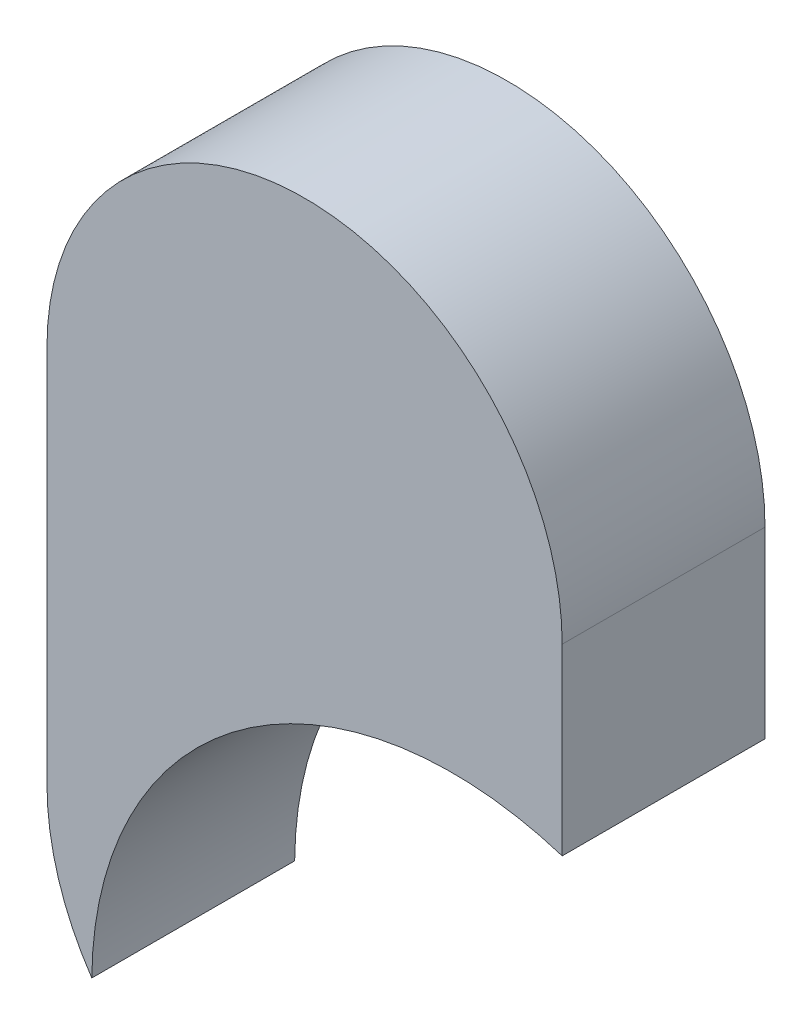
ISO-10303-21;
HEADER;
FILE_DESCRIPTION(('STEP AP214'),'2;1');
FILE_NAME('part.step','',(''),(''),'','','');
FILE_SCHEMA(('AUTOMOTIVE_DESIGN { 1 0 10303 214 1 1 1 1 }'));
ENDSEC;
DATA;
#1=APPLICATION_CONTEXT('core data for automotive mechanical design processes');
#2=APPLICATION_PROTOCOL_DEFINITION('international standard','automotive_design',2000,#1);
#3=PRODUCT_CONTEXT('',#1,'mechanical');
#4=PRODUCT('Part','Part','',(#3));
#5=PRODUCT_RELATED_PRODUCT_CATEGORY('part','',(#4));
#6=PRODUCT_DEFINITION_FORMATION('','',#4);
#7=PRODUCT_DEFINITION_CONTEXT('part definition',#1,'design');
#8=PRODUCT_DEFINITION('design','',#6,#7);
#9=PRODUCT_DEFINITION_SHAPE('','',#8);
#10=(LENGTH_UNIT() NAMED_UNIT(*) SI_UNIT(.MILLI.,.METRE.));
#11=(NAMED_UNIT(*) PLANE_ANGLE_UNIT() SI_UNIT($,.RADIAN.));
#12=(NAMED_UNIT(*) SI_UNIT($,.STERADIAN.) SOLID_ANGLE_UNIT());
#13=UNCERTAINTY_MEASURE_WITH_UNIT(LENGTH_MEASURE(1.E-05),#10,'distance_accuracy_value','');
#14=(GEOMETRIC_REPRESENTATION_CONTEXT(3) GLOBAL_UNCERTAINTY_ASSIGNED_CONTEXT((#13)) GLOBAL_UNIT_ASSIGNED_CONTEXT((#10,
#11,#12)) REPRESENTATION_CONTEXT('',''));
#15=CARTESIAN_POINT('',(0.,0.,0.));
#16=DIRECTION('',(0.,0.,1.));
#17=DIRECTION('',(1.,0.,0.));
#18=AXIS2_PLACEMENT_3D('',#15,#16,#17);
#19=CARTESIAN_POINT('',(119.36119892,98.2557393595537,0.));
#20=DIRECTION('',(-1.,0.,0.));
#21=DIRECTION('',(0.,1.,0.));
#22=AXIS2_PLACEMENT_3D('',#19,#20,#21);
#23=PLANE('',#22);
#24=DIRECTION('',(0.,1.,0.));
#25=VECTOR('',#24,1.);
#26=CARTESIAN_POINT('',(119.36119892,98.06280108,0.1999996));
#27=LINE('',#26,#25);
#28=CARTESIAN_POINT('',(119.36119892,98.2557393595537,0.1999996));
#29=VERTEX_POINT('',#28);
#30=CARTESIAN_POINT('',(119.36119892,98.43653668,0.1999996));
#31=VERTEX_POINT('',#30);
#32=EDGE_CURVE('E11',#29,#31,#27,.T.);
#33=ORIENTED_EDGE('',*,*,#32,.F.);
#34=DIRECTION('',(0.,0.,1.));
#35=VECTOR('',#34,1.);
#36=CARTESIAN_POINT('',(119.36119892,98.2557393595537,0.));
#37=LINE('',#36,#35);
#38=CARTESIAN_POINT('',(119.36119892,98.2557393595537,0.));
#39=VERTEX_POINT('',#38);
#40=EDGE_CURVE('E24',#39,#29,#37,.T.);
#41=ORIENTED_EDGE('',*,*,#40,.F.);
#42=DIRECTION('',(0.,1.,0.));
#43=VECTOR('',#42,1.);
#44=CARTESIAN_POINT('',(119.36119892,98.06280108,0.));
#45=LINE('',#44,#43);
#46=CARTESIAN_POINT('',(119.36119892,98.43653668,0.));
#47=VERTEX_POINT('',#46);
#48=EDGE_CURVE('E82',#39,#47,#45,.T.);
#49=ORIENTED_EDGE('',*,*,#48,.T.);
#50=DIRECTION('',(0.,0.,1.));
#51=VECTOR('',#50,1.);
#52=CARTESIAN_POINT('',(119.36119892,98.43653668,0.));
#53=LINE('',#52,#51);
#54=EDGE_CURVE('E37',#47,#31,#53,.T.);
#55=ORIENTED_EDGE('',*,*,#54,.T.);
#56=EDGE_LOOP('',(#33,#41,#49,#55));
#57=FACE_BOUND('',#56,.T.);
#58=ADVANCED_FACE('F17',(#57),#23,.F.);
#59=CARTESIAN_POINT('',(119.10719892,98.43653668,0.));
#60=DIRECTION('',(0.,0.,-1.));
#61=DIRECTION('',(1.,0.,0.));
#62=AXIS2_PLACEMENT_3D('',#59,#60,#61);
#63=CYLINDRICAL_SURFACE('',#62,0.253999999999995);
#64=CARTESIAN_POINT('',(119.10719892,98.43653668,0.1999996));
#65=DIRECTION('',(0.,0.,1.));
#66=DIRECTION('',(1.,0.,0.));
#67=AXIS2_PLACEMENT_3D('',#64,#65,#66);
#68=CIRCLE('',#67,0.253999999999995);
#69=CARTESIAN_POINT('',(118.85319892,98.43653668,0.1999996));
#70=VERTEX_POINT('',#69);
#71=EDGE_CURVE('E98',#31,#70,#68,.T.);
#72=ORIENTED_EDGE('',*,*,#71,.F.);
#73=ORIENTED_EDGE('',*,*,#54,.F.);
#74=CARTESIAN_POINT('',(119.10719892,98.43653668,0.));
#75=DIRECTION('',(0.,0.,1.));
#76=DIRECTION('',(1.,0.,0.));
#77=AXIS2_PLACEMENT_3D('',#74,#75,#76);
#78=CIRCLE('',#77,0.253999999999995);
#79=CARTESIAN_POINT('',(118.85319892,98.43653668,0.));
#80=VERTEX_POINT('',#79);
#81=EDGE_CURVE('E95',#47,#80,#78,.T.);
#82=ORIENTED_EDGE('',*,*,#81,.T.);
#83=DIRECTION('',(0.,0.,1.));
#84=VECTOR('',#83,1.);
#85=CARTESIAN_POINT('',(118.85319892,98.43653668,0.));
#86=LINE('',#85,#84);
#87=EDGE_CURVE('E93',#80,#70,#86,.T.);
#88=ORIENTED_EDGE('',*,*,#87,.T.);
#89=EDGE_LOOP('',(#72,#73,#82,#88));
#90=FACE_BOUND('',#89,.T.);
#91=ADVANCED_FACE('F104',(#90),#63,.T.);
#92=CARTESIAN_POINT('',(118.85319892,98.43653668,0.));
#93=DIRECTION('',(1.,0.,0.));
#94=DIRECTION('',(0.,-1.,0.));
#95=AXIS2_PLACEMENT_3D('',#92,#93,#94);
#96=PLANE('',#95);
#97=DIRECTION('',(0.,-1.,0.));
#98=VECTOR('',#97,1.);
#99=CARTESIAN_POINT('',(118.85319892,98.43653668,0.1999996));
#100=LINE('',#99,#98);
#101=CARTESIAN_POINT('',(118.85319892,98.06280108,0.1999996));
#102=VERTEX_POINT('',#101);
#103=EDGE_CURVE('E90',#70,#102,#100,.T.);
#104=ORIENTED_EDGE('',*,*,#103,.F.);
#105=ORIENTED_EDGE('',*,*,#87,.F.);
#106=DIRECTION('',(0.,-1.,0.));
#107=VECTOR('',#106,1.);
#108=CARTESIAN_POINT('',(118.85319892,98.43653668,0.));
#109=LINE('',#108,#107);
#110=CARTESIAN_POINT('',(118.85319892,98.06280108,0.));
#111=VERTEX_POINT('',#110);
#112=EDGE_CURVE('E88',#80,#111,#109,.T.);
#113=ORIENTED_EDGE('',*,*,#112,.T.);
#114=DIRECTION('',(0.,0.,1.));
#115=VECTOR('',#114,1.);
#116=CARTESIAN_POINT('',(118.85319892,98.06280108,0.));
#117=LINE('',#116,#115);
#118=EDGE_CURVE('E73',#111,#102,#117,.T.);
#119=ORIENTED_EDGE('',*,*,#118,.T.);
#120=EDGE_LOOP('',(#104,#105,#113,#119));
#121=FACE_BOUND('',#120,.T.);
#122=ADVANCED_FACE('F109',(#121),#96,.F.);
#123=CARTESIAN_POINT('',(119.10719892,98.06280108,0.));
#124=DIRECTION('',(0.,0.,-1.));
#125=DIRECTION('',(-1.,0.,0.));
#126=AXIS2_PLACEMENT_3D('',#123,#124,#125);
#127=CYLINDRICAL_SURFACE('',#126,0.254);
#128=CARTESIAN_POINT('',(119.10719892,98.06280108,0.1999996));
#129=DIRECTION('',(0.,0.,1.));
#130=DIRECTION('',(-1.,0.,0.));
#131=AXIS2_PLACEMENT_3D('',#128,#129,#130);
#132=CIRCLE('',#131,0.254);
#133=CARTESIAN_POINT('',(118.897409559521,97.9196074201206,0.1999996));
#134=VERTEX_POINT('',#133);
#135=EDGE_CURVE('E77',#102,#134,#132,.T.);
#136=ORIENTED_EDGE('',*,*,#135,.F.);
#137=ORIENTED_EDGE('',*,*,#118,.F.);
#138=CARTESIAN_POINT('',(119.10719892,98.06280108,0.));
#139=DIRECTION('',(0.,0.,1.));
#140=DIRECTION('',(-1.,0.,0.));
#141=AXIS2_PLACEMENT_3D('',#138,#139,#140);
#142=CIRCLE('',#141,0.254);
#143=CARTESIAN_POINT('',(118.897409559521,97.9196074201206,0.));
#144=VERTEX_POINT('',#143);
#145=EDGE_CURVE('E69',#111,#144,#142,.T.);
#146=ORIENTED_EDGE('',*,*,#145,.T.);
#147=DIRECTION('',(0.,0.,1.));
#148=VECTOR('',#147,1.);
#149=CARTESIAN_POINT('',(118.897409559521,97.9196074201206,0.));
#150=LINE('',#149,#148);
#151=EDGE_CURVE('E59',#144,#134,#150,.T.);
#152=ORIENTED_EDGE('',*,*,#151,.T.);
#153=EDGE_LOOP('',(#136,#137,#146,#152));
#154=FACE_BOUND('',#153,.T.);
#155=ADVANCED_FACE('F72',(#154),#127,.T.);
#156=CARTESIAN_POINT('',(119.253,97.917,0.));
#157=DIRECTION('',(0.,0.,-1.));
#158=DIRECTION('',(1.,0.,0.));
#159=AXIS2_PLACEMENT_3D('',#156,#157,#158);
#160=CYLINDRICAL_SURFACE('',#159,0.3556);
#161=ORIENTED_EDGE('',*,*,#40,.T.);
#162=CARTESIAN_POINT('',(119.253,97.917,0.1999996));
#163=DIRECTION('',(0.,0.,1.));
#164=DIRECTION('',(1.,0.,0.));
#165=AXIS2_PLACEMENT_3D('',#162,#163,#164);
#166=CIRCLE('',#165,0.3556);
#167=EDGE_CURVE('E65',#29,#134,#166,.T.);
#168=ORIENTED_EDGE('',*,*,#167,.T.);
#169=ORIENTED_EDGE('',*,*,#151,.F.);
#170=CARTESIAN_POINT('',(119.253,97.917,0.));
#171=DIRECTION('',(0.,0.,1.));
#172=DIRECTION('',(1.,0.,0.));
#173=AXIS2_PLACEMENT_3D('',#170,#171,#172);
#174=CIRCLE('',#173,0.3556);
#175=EDGE_CURVE('E63',#39,#144,#174,.T.);
#176=ORIENTED_EDGE('',*,*,#175,.F.);
#177=EDGE_LOOP('',(#161,#168,#169,#176));
#178=FACE_BOUND('',#177,.T.);
#179=ADVANCED_FACE('F61',(#178),#160,.F.);
#180=CARTESIAN_POINT('',(119.36119892,98.06280108,0.));
#181=DIRECTION('',(0.,0.,-1.));
#182=DIRECTION('',(-1.,0.,0.));
#183=AXIS2_PLACEMENT_3D('',#180,#181,#182);
#184=PLANE('',#183);
#185=ORIENTED_EDGE('',*,*,#48,.F.);
#186=ORIENTED_EDGE('',*,*,#175,.T.);
#187=ORIENTED_EDGE('',*,*,#145,.F.);
#188=ORIENTED_EDGE('',*,*,#112,.F.);
#189=ORIENTED_EDGE('',*,*,#81,.F.);
#190=EDGE_LOOP('',(#185,#186,#187,#188,#189));
#191=FACE_BOUND('',#190,.T.);
#192=ADVANCED_FACE('F80',(#191),#184,.T.);
#193=CARTESIAN_POINT('',(119.36119892,98.06280108,0.1999996));
#194=DIRECTION('',(0.,0.,-1.));
#195=DIRECTION('',(-1.,0.,0.));
#196=AXIS2_PLACEMENT_3D('',#193,#194,#195);
#197=PLANE('',#196);
#198=ORIENTED_EDGE('',*,*,#167,.F.);
#199=ORIENTED_EDGE('',*,*,#32,.T.);
#200=ORIENTED_EDGE('',*,*,#71,.T.);
#201=ORIENTED_EDGE('',*,*,#103,.T.);
#202=ORIENTED_EDGE('',*,*,#135,.T.);
#203=EDGE_LOOP('',(#198,#199,#200,#201,#202));
#204=FACE_BOUND('',#203,.T.);
#205=ADVANCED_FACE('F107',(#204),#197,.F.);
#206=CLOSED_SHELL('',(#58,#91,#122,#155,#179,#192,#205));
#207=MANIFOLD_SOLID_BREP('B1',#206);
#208=ADVANCED_BREP_SHAPE_REPRESENTATION('',(#18,#207),#14);
#209=SHAPE_DEFINITION_REPRESENTATION(#9,#208);
ENDSEC;
END-ISO-10303-21;
